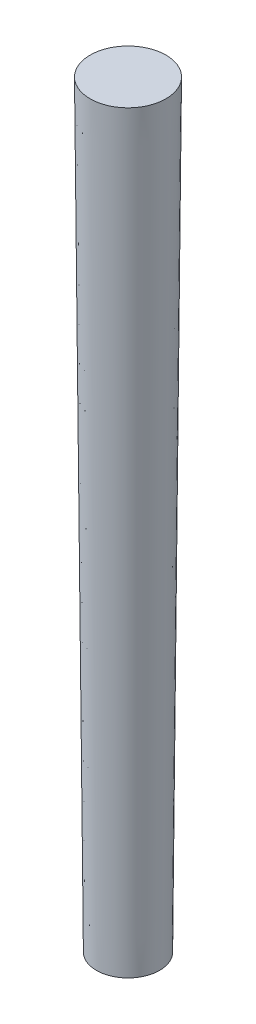
ISO-10303-21;
HEADER;
FILE_DESCRIPTION(('STEP AP214'),'2;1');
FILE_NAME('part.step','',(''),(''),'','','');
FILE_SCHEMA(('AUTOMOTIVE_DESIGN { 1 0 10303 214 1 1 1 1 }'));
ENDSEC;
DATA;
#1=APPLICATION_CONTEXT('core data for automotive mechanical design processes');
#2=APPLICATION_PROTOCOL_DEFINITION('international standard','automotive_design',2000,#1);
#3=PRODUCT_CONTEXT('',#1,'mechanical');
#4=PRODUCT('Part','Part','',(#3));
#5=PRODUCT_RELATED_PRODUCT_CATEGORY('part','',(#4));
#6=PRODUCT_DEFINITION_FORMATION('','',#4);
#7=PRODUCT_DEFINITION_CONTEXT('part definition',#1,'design');
#8=PRODUCT_DEFINITION('design','',#6,#7);
#9=PRODUCT_DEFINITION_SHAPE('','',#8);
#10=(LENGTH_UNIT() NAMED_UNIT(*) SI_UNIT(.MILLI.,.METRE.));
#11=(NAMED_UNIT(*) PLANE_ANGLE_UNIT() SI_UNIT($,.RADIAN.));
#12=(NAMED_UNIT(*) SI_UNIT($,.STERADIAN.) SOLID_ANGLE_UNIT());
#13=UNCERTAINTY_MEASURE_WITH_UNIT(LENGTH_MEASURE(1.E-05),#10,'distance_accuracy_value','');
#14=(GEOMETRIC_REPRESENTATION_CONTEXT(3) GLOBAL_UNCERTAINTY_ASSIGNED_CONTEXT((#13)) GLOBAL_UNIT_ASSIGNED_CONTEXT((#10,
#11,#12)) REPRESENTATION_CONTEXT('',''));
#15=CARTESIAN_POINT('',(0.,0.,0.));
#16=DIRECTION('',(0.,0.,1.));
#17=DIRECTION('',(1.,0.,0.));
#18=AXIS2_PLACEMENT_3D('',#15,#16,#17);
#19=CARTESIAN_POINT('',(0.,11.1148351648351,0.));
#20=DIRECTION('',(0.,1.,0.));
#21=DIRECTION('',(0.,0.,1.));
#22=AXIS2_PLACEMENT_3D('',#19,#20,#21);
#23=PLANE('',#22);
#24=CARTESIAN_POINT('',(0.,11.1148351648351,0.));
#25=DIRECTION('',(0.,-1.,0.));
#26=DIRECTION('',(0.,0.,-1.));
#27=AXIS2_PLACEMENT_3D('',#24,#25,#26);
#28=CIRCLE('',#27,0.989999999999997);
#29=CARTESIAN_POINT('',(0.,11.1148351648351,-0.989999999999997));
#30=VERTEX_POINT('',#29);
#31=EDGE_CURVE('E43',#30,#30,#28,.T.);
#32=ORIENTED_EDGE('',*,*,#31,.F.);
#33=EDGE_LOOP('',(#32));
#34=FACE_BOUND('',#33,.T.);
#35=ADVANCED_FACE('F36',(#34),#23,.T.);
#36=CARTESIAN_POINT('',(0.825,-8.68516483516486,0.));
#37=DIRECTION('',(0.,-1.,0.));
#38=DIRECTION('',(0.,0.,-1.));
#39=AXIS2_PLACEMENT_3D('',#36,#37,#38);
#40=PLANE('',#39);
#41=CARTESIAN_POINT('',(0.,-8.68516483516486,0.));
#42=DIRECTION('',(0.,-1.,0.));
#43=DIRECTION('',(0.,0.,-1.));
#44=AXIS2_PLACEMENT_3D('',#41,#42,#43);
#45=CIRCLE('',#44,0.825);
#46=CARTESIAN_POINT('',(0.,-8.68516483516486,-0.825));
#47=VERTEX_POINT('',#46);
#48=EDGE_CURVE('E10',#47,#47,#45,.T.);
#49=ORIENTED_EDGE('',*,*,#48,.T.);
#50=EDGE_LOOP('',(#49));
#51=FACE_BOUND('',#50,.T.);
#52=ADVANCED_FACE('F54',(#51),#40,.T.);
#53=CARTESIAN_POINT('',(0.,-8.68516483516486,0.));
#54=DIRECTION('',(0.,1.,0.));
#55=DIRECTION('',(0.,0.,1.));
#56=AXIS2_PLACEMENT_3D('',#53,#54,#55);
#57=CONICAL_SURFACE('',#56,0.825,0.00833314044013574);
#58=ORIENTED_EDGE('',*,*,#31,.T.);
#59=EDGE_LOOP('',(#58));
#60=FACE_BOUND('',#59,.T.);
#61=ORIENTED_EDGE('',*,*,#48,.F.);
#62=EDGE_LOOP('',(#61));
#63=FACE_BOUND('',#62,.T.);
#64=ADVANCED_FACE('F50',(#60,#63),#57,.T.);
#65=CLOSED_SHELL('',(#35,#52,#64));
#66=MANIFOLD_SOLID_BREP('B2',#65);
#67=ADVANCED_BREP_SHAPE_REPRESENTATION('',(#18,#66),#14);
#68=SHAPE_DEFINITION_REPRESENTATION(#9,#67);
ENDSEC;
END-ISO-10303-21;
